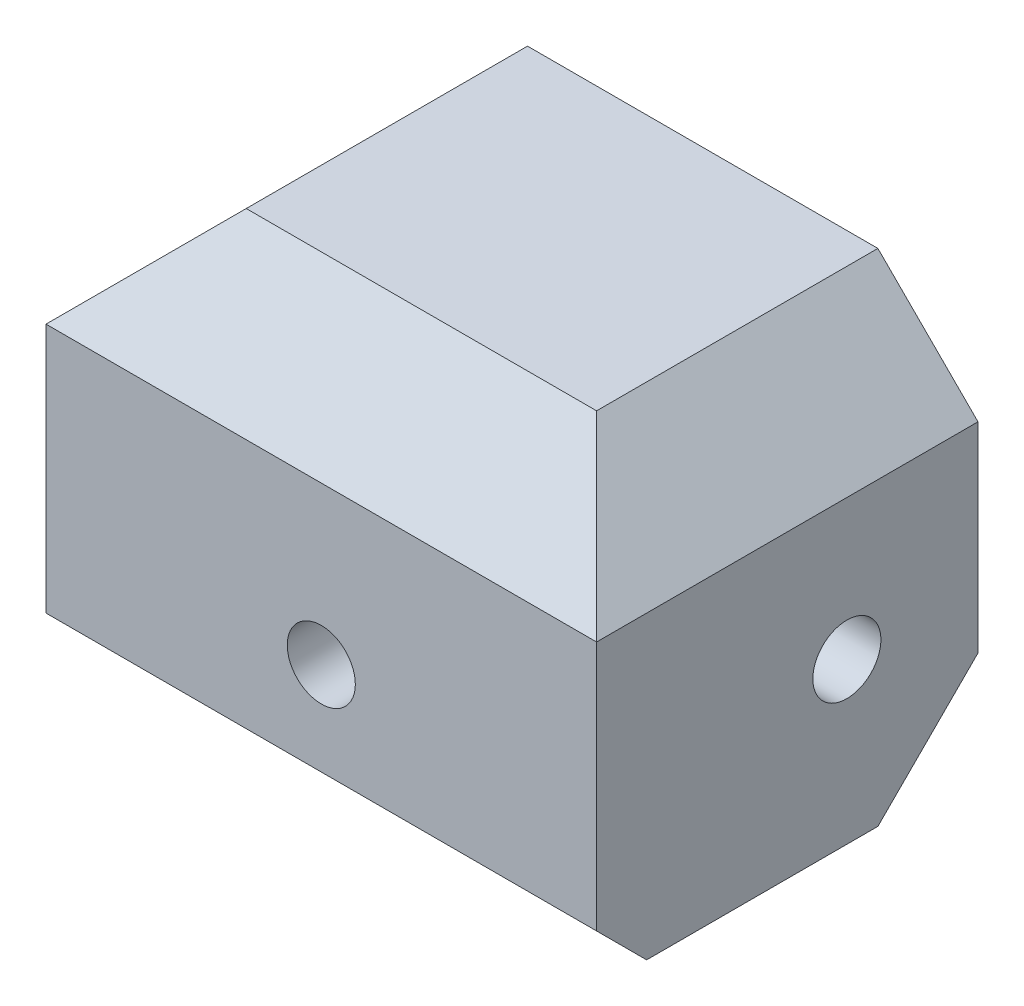
ISO-10303-21;
HEADER;
FILE_DESCRIPTION(('STEP AP214'),'2;1');
FILE_NAME('part.step','',(''),(''),'','','');
FILE_SCHEMA(('AUTOMOTIVE_DESIGN { 1 0 10303 214 1 1 1 1 }'));
ENDSEC;
DATA;
#1=APPLICATION_CONTEXT('core data for automotive mechanical design processes');
#2=APPLICATION_PROTOCOL_DEFINITION('international standard','automotive_design',2000,#1);
#3=PRODUCT_CONTEXT('',#1,'mechanical');
#4=PRODUCT('Part','Part','',(#3));
#5=PRODUCT_RELATED_PRODUCT_CATEGORY('part','',(#4));
#6=PRODUCT_DEFINITION_FORMATION('','',#4);
#7=PRODUCT_DEFINITION_CONTEXT('part definition',#1,'design');
#8=PRODUCT_DEFINITION('design','',#6,#7);
#9=PRODUCT_DEFINITION_SHAPE('','',#8);
#10=(LENGTH_UNIT() NAMED_UNIT(*) SI_UNIT(.MILLI.,.METRE.));
#11=(NAMED_UNIT(*) PLANE_ANGLE_UNIT() SI_UNIT($,.RADIAN.));
#12=(NAMED_UNIT(*) SI_UNIT($,.STERADIAN.) SOLID_ANGLE_UNIT());
#13=UNCERTAINTY_MEASURE_WITH_UNIT(LENGTH_MEASURE(1.E-05),#10,'distance_accuracy_value','');
#14=(GEOMETRIC_REPRESENTATION_CONTEXT(3) GLOBAL_UNCERTAINTY_ASSIGNED_CONTEXT((#13)) GLOBAL_UNIT_ASSIGNED_CONTEXT((#10,
#11,#12)) REPRESENTATION_CONTEXT('',''));
#15=CARTESIAN_POINT('',(0.,0.,0.));
#16=DIRECTION('',(0.,0.,1.));
#17=DIRECTION('',(1.,0.,0.));
#18=AXIS2_PLACEMENT_3D('',#15,#16,#17);
#19=CARTESIAN_POINT('',(-170.364347611488,-245.852505007974,-281.719428592597));
#20=DIRECTION('',(0.,-1.,0.));
#21=DIRECTION('',(0.,0.,-1.));
#22=AXIS2_PLACEMENT_3D('',#19,#20,#21);
#23=CONICAL_SURFACE('',#22,3.39999999999097,1.02974425868382);
#24=CARTESIAN_POINT('',(-170.364347611496,-243.809578903324,-281.719428592597));
#25=VERTEX_POINT('',#24);
#26=VERTEX_LOOP('',#25);
#27=FACE_BOUND('',#26,.T.);
#28=CARTESIAN_POINT('',(-170.364347611488,-245.852505008048,-281.719428592597));
#29=DIRECTION('',(0.,-1.,0.));
#30=DIRECTION('',(0.,0.,-1.));
#31=AXIS2_PLACEMENT_3D('',#28,#29,#30);
#32=CIRCLE('',#31,3.4);
#33=CARTESIAN_POINT('',(-170.364347611488,-245.852505008048,-285.119428592597));
#34=VERTEX_POINT('',#33);
#35=EDGE_CURVE('E311',#34,#34,#32,.T.);
#36=ORIENTED_EDGE('',*,*,#35,.T.);
#37=EDGE_LOOP('',(#36));
#38=FACE_BOUND('',#37,.T.);
#39=ADVANCED_FACE('F17',(#27,#38),#23,.F.);
#40=CARTESIAN_POINT('',(-134.614347611488,-245.852505008031,-281.719428592597));
#41=DIRECTION('',(0.,-1.,0.));
#42=DIRECTION('',(0.,0.,-1.));
#43=AXIS2_PLACEMENT_3D('',#40,#41,#42);
#44=CONICAL_SURFACE('',#43,3.39999999999824,1.02974425867343);
#45=CARTESIAN_POINT('',(-134.614347611489,-243.809578903324,-281.719428592597));
#46=VERTEX_POINT('',#45);
#47=VERTEX_LOOP('',#46);
#48=FACE_BOUND('',#47,.T.);
#49=CARTESIAN_POINT('',(-134.614347611488,-245.852505008048,-281.719428592597));
#50=DIRECTION('',(0.,-1.,0.));
#51=DIRECTION('',(0.,0.,-1.));
#52=AXIS2_PLACEMENT_3D('',#49,#50,#51);
#53=CIRCLE('',#52,3.4);
#54=CARTESIAN_POINT('',(-134.614347611488,-245.852505008048,-285.119428592597));
#55=VERTEX_POINT('',#54);
#56=EDGE_CURVE('E170',#55,#55,#53,.T.);
#57=ORIENTED_EDGE('',*,*,#56,.T.);
#58=EDGE_LOOP('',(#57));
#59=FACE_BOUND('',#58,.T.);
#60=ADVANCED_FACE('F468',(#48,#59),#44,.F.);
#61=CARTESIAN_POINT('',(-170.364347611488,-269.352505008048,-281.719428592597));
#62=DIRECTION('',(0.,-1.,0.));
#63=DIRECTION('',(0.,0.,-1.));
#64=AXIS2_PLACEMENT_3D('',#61,#62,#63);
#65=CYLINDRICAL_SURFACE('',#64,3.4);
#66=ORIENTED_EDGE('',*,*,#35,.F.);
#67=EDGE_LOOP('',(#66));
#68=FACE_BOUND('',#67,.T.);
#69=CARTESIAN_POINT('',(-170.364347611488,-268.681335320139,-281.719428592597));
#70=DIRECTION('',(0.,-1.,0.));
#71=DIRECTION('',(1.,0.,0.));
#72=AXIS2_PLACEMENT_3D('',#69,#70,#71);
#73=CIRCLE('',#72,3.39999999999097);
#74=CARTESIAN_POINT('',(-166.964347611497,-268.681335320139,-281.719428592597));
#75=VERTEX_POINT('',#74);
#76=EDGE_CURVE('E189',#75,#75,#73,.T.);
#77=ORIENTED_EDGE('',*,*,#76,.T.);
#78=EDGE_LOOP('',(#77));
#79=FACE_BOUND('',#78,.T.);
#80=ADVANCED_FACE('F465',(#68,#79),#65,.F.);
#81=CARTESIAN_POINT('',(-134.614347611488,-269.352505008048,-281.719428592597));
#82=DIRECTION('',(0.,-1.,0.));
#83=DIRECTION('',(0.,0.,-1.));
#84=AXIS2_PLACEMENT_3D('',#81,#82,#83);
#85=CYLINDRICAL_SURFACE('',#84,3.4);
#86=ORIENTED_EDGE('',*,*,#56,.F.);
#87=EDGE_LOOP('',(#86));
#88=FACE_BOUND('',#87,.T.);
#89=CARTESIAN_POINT('',(-134.614347611488,-268.681335320139,-281.719428592597));
#90=DIRECTION('',(0.,-1.,0.));
#91=DIRECTION('',(1.,0.,0.));
#92=AXIS2_PLACEMENT_3D('',#89,#90,#91);
#93=CIRCLE('',#92,3.39999999999824);
#94=CARTESIAN_POINT('',(-131.21434761149,-268.681335320139,-281.719428592597));
#95=VERTEX_POINT('',#94);
#96=EDGE_CURVE('E288',#95,#95,#93,.T.);
#97=ORIENTED_EDGE('',*,*,#96,.T.);
#98=EDGE_LOOP('',(#97));
#99=FACE_BOUND('',#98,.T.);
#100=ADVANCED_FACE('F352',(#88,#99),#85,.F.);
#101=CARTESIAN_POINT('',(-170.489350011488,-253.352505008048,-295.619428592597));
#102=DIRECTION('',(1.,0.,0.));
#103=DIRECTION('',(0.,0.,-1.));
#104=AXIS2_PLACEMENT_3D('',#101,#102,#103);
#105=CYLINDRICAL_SURFACE('',#104,6.);
#106=CARTESIAN_POINT('',(-144.239347611488,-253.352505008048,-295.619428592597));
#107=DIRECTION('',(1.,0.,0.));
#108=DIRECTION('',(0.,0.,-1.));
#109=AXIS2_PLACEMENT_3D('',#106,#107,#108);
#110=CIRCLE('',#109,6.);
#111=CARTESIAN_POINT('',(-144.239347611488,-253.352505008048,-301.619428592597));
#112=VERTEX_POINT('',#111);
#113=EDGE_CURVE('E267',#112,#112,#110,.T.);
#114=ORIENTED_EDGE('',*,*,#113,.F.);
#115=EDGE_LOOP('',(#114));
#116=FACE_BOUND('',#115,.T.);
#117=CARTESIAN_POINT('',(-139.489347611489,-253.352505008048,-295.619428592597));
#118=DIRECTION('',(1.,0.,0.));
#119=DIRECTION('',(0.,0.,-1.));
#120=AXIS2_PLACEMENT_3D('',#117,#118,#119);
#121=CIRCLE('',#120,6.);
#122=CARTESIAN_POINT('',(-139.489347611489,-253.352505008048,-301.619428592597));
#123=VERTEX_POINT('',#122);
#124=EDGE_CURVE('E20',#123,#123,#121,.T.);
#125=ORIENTED_EDGE('',*,*,#124,.T.);
#126=EDGE_LOOP('',(#125));
#127=FACE_BOUND('',#126,.T.);
#128=ADVANCED_FACE('F349',(#116,#127),#105,.F.);
#129=CARTESIAN_POINT('',(-155.739347611488,-239.352505008049,-275.042931195113));
#130=DIRECTION('',(0.,0.,1.));
#131=DIRECTION('',(1.,0.,0.));
#132=AXIS2_PLACEMENT_3D('',#129,#130,#131);
#133=CYLINDRICAL_SURFACE('',#132,5.);
#134=DIRECTION('',(0.,0.,-1.));
#135=VECTOR('',#134,1.);
#136=CARTESIAN_POINT('',(-155.739347611488,-234.352505008049,-278.619428592599));
#137=LINE('',#136,#135);
#138=CARTESIAN_POINT('',(-155.739347611488,-234.352505008049,-278.619428592599));
#139=VERTEX_POINT('',#138);
#140=CARTESIAN_POINT('',(-155.739347611488,-234.352505008067,-305.719428592582));
#141=VERTEX_POINT('',#140);
#142=EDGE_CURVE('E163',#139,#141,#137,.T.);
#143=ORIENTED_EDGE('',*,*,#142,.F.);
#144=CARTESIAN_POINT('',(-155.739347611488,-239.352505008049,-278.619428592599));
#145=DIRECTION('',(0.,0.,1.));
#146=DIRECTION('',(1.,0.,0.));
#147=AXIS2_PLACEMENT_3D('',#144,#145,#146);
#148=CIRCLE('',#147,5.);
#149=CARTESIAN_POINT('',(-160.739347611488,-239.352505008049,-278.619428592599));
#150=VERTEX_POINT('',#149);
#151=EDGE_CURVE('E151',#150,#139,#148,.F.);
#152=ORIENTED_EDGE('',*,*,#151,.F.);
#153=DIRECTION('',(0.,0.,-1.));
#154=VECTOR('',#153,1.);
#155=CARTESIAN_POINT('',(-160.739347611488,-239.352505008049,-275.042931195113));
#156=LINE('',#155,#154);
#157=CARTESIAN_POINT('',(-160.739347611491,-239.352505008049,-305.719428592604));
#158=VERTEX_POINT('',#157);
#159=EDGE_CURVE('E146',#158,#150,#156,.F.);
#160=ORIENTED_EDGE('',*,*,#159,.F.);
#161=CARTESIAN_POINT('',(-155.739347611488,-239.352505008049,-305.719428592624));
#162=DIRECTION('',(0.,0.,-1.));
#163=DIRECTION('',(1.,0.,0.));
#164=AXIS2_PLACEMENT_3D('',#161,#162,#163);
#165=CIRCLE('',#164,5.00000000001088);
#166=EDGE_CURVE('E165',#158,#141,#165,.T.);
#167=ORIENTED_EDGE('',*,*,#166,.T.);
#168=EDGE_LOOP('',(#143,#152,#160,#167));
#169=FACE_BOUND('',#168,.T.);
#170=ADVANCED_FACE('F164',(#169),#133,.F.);
#171=CARTESIAN_POINT('',(-160.739347611488,-234.352505008049,-278.619428592599));
#172=DIRECTION('',(0.,-1.,0.));
#173=DIRECTION('',(0.,0.,-1.));
#174=AXIS2_PLACEMENT_3D('',#171,#172,#173);
#175=PLANE('',#174);
#176=ORIENTED_EDGE('',*,*,#142,.T.);
#177=DIRECTION('',(1.,0.,0.));
#178=VECTOR('',#177,1.);
#179=CARTESIAN_POINT('',(-152.489347611488,-234.352505008049,-305.719428592597));
#180=LINE('',#179,#178);
#181=CARTESIAN_POINT('',(-149.239347611488,-234.352505008042,-305.719428592604));
#182=VERTEX_POINT('',#181);
#183=EDGE_CURVE('E211',#141,#182,#180,.T.);
#184=ORIENTED_EDGE('',*,*,#183,.T.);
#185=DIRECTION('',(0.,0.,-1.));
#186=VECTOR('',#185,1.);
#187=CARTESIAN_POINT('',(-149.239347611488,-234.352505008049,-275.042931195113));
#188=LINE('',#187,#186);
#189=CARTESIAN_POINT('',(-149.239347611488,-234.352505008049,-278.619428592599));
#190=VERTEX_POINT('',#189);
#191=EDGE_CURVE('E169',#182,#190,#188,.F.);
#192=ORIENTED_EDGE('',*,*,#191,.T.);
#193=DIRECTION('',(-1.,0.,0.));
#194=VECTOR('',#193,1.);
#195=CARTESIAN_POINT('',(-153.248722611488,-234.352505008049,-278.619428592599));
#196=LINE('',#195,#194);
#197=EDGE_CURVE('E156',#139,#190,#196,.F.);
#198=ORIENTED_EDGE('',*,*,#197,.F.);
#199=EDGE_LOOP('',(#176,#184,#192,#198));
#200=FACE_BOUND('',#199,.T.);
#201=ADVANCED_FACE('F172',(#200),#175,.T.);
#202=CARTESIAN_POINT('',(-149.239347611488,-239.352505008049,-275.042931195113));
#203=DIRECTION('',(0.,0.,-1.));
#204=DIRECTION('',(-1.,0.,0.));
#205=AXIS2_PLACEMENT_3D('',#202,#203,#204);
#206=CYLINDRICAL_SURFACE('',#205,5.);
#207=DIRECTION('',(0.,0.,1.));
#208=VECTOR('',#207,1.);
#209=CARTESIAN_POINT('',(-144.239347611488,-239.352505008049,-275.042931195113));
#210=LINE('',#209,#208);
#211=CARTESIAN_POINT('',(-144.239347611488,-239.352505008049,-278.619428592599));
#212=VERTEX_POINT('',#211);
#213=CARTESIAN_POINT('',(-144.239347611503,-239.352505008049,-305.719428592582));
#214=VERTEX_POINT('',#213);
#215=EDGE_CURVE('E249',#212,#214,#210,.F.);
#216=ORIENTED_EDGE('',*,*,#215,.F.);
#217=CARTESIAN_POINT('',(-149.239347611488,-239.352505008049,-278.619428592599));
#218=DIRECTION('',(0.,0.,-1.));
#219=DIRECTION('',(-1.,0.,0.));
#220=AXIS2_PLACEMENT_3D('',#217,#218,#219);
#221=CIRCLE('',#220,5.);
#222=EDGE_CURVE('E174',#190,#212,#221,.T.);
#223=ORIENTED_EDGE('',*,*,#222,.F.);
#224=ORIENTED_EDGE('',*,*,#191,.F.);
#225=CARTESIAN_POINT('',(-149.239347611488,-239.352505008049,-305.719428592624));
#226=DIRECTION('',(0.,0.,-1.));
#227=DIRECTION('',(1.,0.,0.));
#228=AXIS2_PLACEMENT_3D('',#225,#226,#227);
#229=CIRCLE('',#228,5.0000000000277);
#230=EDGE_CURVE('E217',#182,#214,#229,.T.);
#231=ORIENTED_EDGE('',*,*,#230,.T.);
#232=EDGE_LOOP('',(#216,#223,#224,#231));
#233=FACE_BOUND('',#232,.T.);
#234=ADVANCED_FACE('F361',(#233),#206,.F.);
#235=CARTESIAN_POINT('',(-139.489347611489,-261.738995628892,-289.669428592597));
#236=DIRECTION('',(1.,0.,0.));
#237=DIRECTION('',(0.,0.,-1.));
#238=AXIS2_PLACEMENT_3D('',#235,#236,#237);
#239=PLANE('',#238);
#240=ORIENTED_EDGE('',*,*,#124,.F.);
#241=EDGE_LOOP('',(#240));
#242=FACE_BOUND('',#241,.T.);
#243=CARTESIAN_POINT('',(-139.489347611489,-253.352505008048,-295.619428592597));
#244=DIRECTION('',(-1.,0.,0.));
#245=DIRECTION('',(0.,0.,1.));
#246=AXIS2_PLACEMENT_3D('',#243,#244,#245);
#247=CIRCLE('',#246,3.4);
#248=CARTESIAN_POINT('',(-139.489347611489,-253.352505008048,-292.219428592597));
#249=VERTEX_POINT('',#248);
#250=EDGE_CURVE('E245',#249,#249,#247,.F.);
#251=ORIENTED_EDGE('',*,*,#250,.T.);
#252=EDGE_LOOP('',(#251));
#253=FACE_BOUND('',#252,.T.);
#254=ADVANCED_FACE('F357',(#242,#253),#239,.F.);
#255=CARTESIAN_POINT('',(-142.739347611488,-251.852505008048,-307.219428592597));
#256=DIRECTION('',(-0.707106781186548,0.,-0.707106781186548));
#257=DIRECTION('',(-0.707106781186548,0.,0.707106781186548));
#258=AXIS2_PLACEMENT_3D('',#255,#256,#257);
#259=PLANE('',#258);
#260=DIRECTION('',(0.,1.,0.));
#261=VECTOR('',#260,1.);
#262=CARTESIAN_POINT('',(-144.239347611488,-235.674328388582,-305.719428592597));
#263=LINE('',#262,#261);
#264=CARTESIAN_POINT('',(-144.239347611488,-262.352505008048,-305.719428592597));
#265=VERTEX_POINT('',#264);
#266=EDGE_CURVE('E183',#214,#265,#263,.F.);
#267=ORIENTED_EDGE('',*,*,#266,.F.);
#268=DIRECTION('',(-0.707106781186548,0.,0.707106781186548));
#269=VECTOR('',#268,1.);
#270=CARTESIAN_POINT('',(498550.041223796,-239.352505008049,-499000.));
#271=LINE('',#270,#269);
#272=CARTESIAN_POINT('',(-141.239347611499,-239.352505008049,-308.719428592564));
#273=VERTEX_POINT('',#272);
#274=EDGE_CURVE('E214',#214,#273,#271,.F.);
#275=ORIENTED_EDGE('',*,*,#274,.T.);
#276=DIRECTION('',(0.,1.,0.));
#277=VECTOR('',#276,1.);
#278=CARTESIAN_POINT('',(-141.239347611488,-249.352505008049,-308.719428592597));
#279=LINE('',#278,#277);
#280=CARTESIAN_POINT('',(-141.239347611488,-259.352505008048,-308.719428592597));
#281=VERTEX_POINT('',#280);
#282=EDGE_CURVE('E223',#281,#273,#279,.T.);
#283=ORIENTED_EDGE('',*,*,#282,.F.);
#284=DIRECTION('',(0.577350269189626,0.577350269189626,-0.577350269189626));
#285=VECTOR('',#284,1.);
#286=CARTESIAN_POINT('',(-144.239347611488,-262.352505008048,-305.719428592597));
#287=LINE('',#286,#285);
#288=EDGE_CURVE('E227',#265,#281,#287,.T.);
#289=ORIENTED_EDGE('',*,*,#288,.F.);
#290=EDGE_LOOP('',(#267,#275,#283,#289));
#291=FACE_BOUND('',#290,.T.);
#292=ADVANCED_FACE('F360',(#291),#259,.T.);
#293=CARTESIAN_POINT('',(-149.239347611488,-239.352505008049,-308.719428592497));
#294=DIRECTION('',(0.,0.,-1.));
#295=DIRECTION('',(-1.,0.,0.));
#296=AXIS2_PLACEMENT_3D('',#293,#294,#295);
#297=CONICAL_SURFACE('',#296,7.99999999989992,0.785398163397448);
#298=DIRECTION('',(0.,-0.707106781186548,0.707106781186548));
#299=VECTOR('',#298,1.);
#300=CARTESIAN_POINT('',(-149.239347611488,-232.852505008049,-307.219428592597));
#301=LINE('',#300,#299);
#302=CARTESIAN_POINT('',(-149.239347611488,-231.35250500807,-308.719428592575));
#303=VERTEX_POINT('',#302);
#304=EDGE_CURVE('E206',#182,#303,#301,.F.);
#305=ORIENTED_EDGE('',*,*,#304,.T.);
#306=CARTESIAN_POINT('',(-149.239347611488,-239.352505008049,-308.719428592553));
#307=DIRECTION('',(0.,0.,-1.));
#308=DIRECTION('',(-1.,0.,0.));
#309=AXIS2_PLACEMENT_3D('',#306,#307,#308);
#310=CIRCLE('',#309,7.99999999995676);
#311=EDGE_CURVE('E339',#273,#303,#310,.F.);
#312=ORIENTED_EDGE('',*,*,#311,.F.);
#313=ORIENTED_EDGE('',*,*,#274,.F.);
#314=ORIENTED_EDGE('',*,*,#230,.F.);
#315=EDGE_LOOP('',(#305,#312,#313,#314));
#316=FACE_BOUND('',#315,.T.);
#317=ADVANCED_FACE('F448',(#316),#297,.F.);
#318=CARTESIAN_POINT('',(-152.489347611488,-232.852505008049,-307.219428592597));
#319=DIRECTION('',(0.,0.707106781186548,0.707106781186548));
#320=DIRECTION('',(0.,-0.707106781186548,0.707106781186548));
#321=AXIS2_PLACEMENT_3D('',#318,#319,#320);
#322=PLANE('',#321);
#323=ORIENTED_EDGE('',*,*,#304,.F.);
#324=ORIENTED_EDGE('',*,*,#183,.F.);
#325=DIRECTION('',(0.,-0.707106781186548,0.707106781186548));
#326=VECTOR('',#325,1.);
#327=CARTESIAN_POINT('',(-155.73934761158,498459.928066399,-499000.));
#328=LINE('',#327,#326);
#329=CARTESIAN_POINT('',(-155.739347611488,-231.352505008058,-308.719428592564));
#330=VERTEX_POINT('',#329);
#331=EDGE_CURVE('E203',#141,#330,#328,.F.);
#332=ORIENTED_EDGE('',*,*,#331,.T.);
#333=DIRECTION('',(-1.,0.,0.));
#334=VECTOR('',#333,1.);
#335=CARTESIAN_POINT('',(-152.489347611488,-231.352505008048,-308.719428592597));
#336=LINE('',#335,#334);
#337=EDGE_CURVE('E338',#303,#330,#336,.T.);
#338=ORIENTED_EDGE('',*,*,#337,.F.);
#339=EDGE_LOOP('',(#323,#324,#332,#338));
#340=FACE_BOUND('',#339,.T.);
#341=ADVANCED_FACE('F444',(#340),#322,.F.);
#342=CARTESIAN_POINT('',(-155.739347611488,-239.352505008049,-308.719428592497));
#343=DIRECTION('',(0.,0.,-1.));
#344=DIRECTION('',(-1.,0.,0.));
#345=AXIS2_PLACEMENT_3D('',#342,#343,#344);
#346=CONICAL_SURFACE('',#345,7.9999999998831,0.785398163397448);
#347=DIRECTION('',(-0.707106781186548,0.,-0.707106781186548));
#348=VECTOR('',#347,1.);
#349=CARTESIAN_POINT('',(-162.239347611488,-239.352505008049,-307.219428592597));
#350=LINE('',#349,#348);
#351=CARTESIAN_POINT('',(-163.739347611466,-239.352505008049,-308.719428592575));
#352=VERTEX_POINT('',#351);
#353=EDGE_CURVE('E186',#352,#158,#350,.F.);
#354=ORIENTED_EDGE('',*,*,#353,.F.);
#355=CARTESIAN_POINT('',(-155.739347611488,-239.352505008049,-308.719428592553));
#356=DIRECTION('',(0.,0.,-1.));
#357=DIRECTION('',(-1.,0.,0.));
#358=AXIS2_PLACEMENT_3D('',#355,#356,#357);
#359=CIRCLE('',#358,7.99999999993994);
#360=EDGE_CURVE('E336',#330,#352,#359,.F.);
#361=ORIENTED_EDGE('',*,*,#360,.F.);
#362=ORIENTED_EDGE('',*,*,#331,.F.);
#363=ORIENTED_EDGE('',*,*,#166,.F.);
#364=EDGE_LOOP('',(#354,#361,#362,#363));
#365=FACE_BOUND('',#364,.T.);
#366=ADVANCED_FACE('F440',(#365),#346,.F.);
#367=CARTESIAN_POINT('',(-162.239347611488,-251.852505008048,-307.219428592597));
#368=DIRECTION('',(0.707106781186548,0.,-0.707106781186548));
#369=DIRECTION('',(-0.707106781186548,0.,-0.707106781186548));
#370=AXIS2_PLACEMENT_3D('',#367,#368,#369);
#371=PLANE('',#370);
#372=DIRECTION('',(0.,1.,0.));
#373=VECTOR('',#372,1.);
#374=CARTESIAN_POINT('',(-163.739347611488,-249.352505008049,-308.719428592597));
#375=LINE('',#374,#373);
#376=CARTESIAN_POINT('',(-163.739347611488,-259.352505008048,-308.719428592597));
#377=VERTEX_POINT('',#376);
#378=EDGE_CURVE('E196',#352,#377,#375,.F.);
#379=ORIENTED_EDGE('',*,*,#378,.F.);
#380=ORIENTED_EDGE('',*,*,#353,.T.);
#381=DIRECTION('',(0.,1.,0.));
#382=VECTOR('',#381,1.);
#383=CARTESIAN_POINT('',(-160.739347611488,-270.674328388582,-305.719428592597));
#384=LINE('',#383,#382);
#385=CARTESIAN_POINT('',(-160.739347611488,-262.352505008048,-305.719428592597));
#386=VERTEX_POINT('',#385);
#387=EDGE_CURVE('E281',#386,#158,#384,.T.);
#388=ORIENTED_EDGE('',*,*,#387,.F.);
#389=DIRECTION('',(0.577350269189626,-0.577350269189626,0.577350269189626));
#390=VECTOR('',#389,1.);
#391=CARTESIAN_POINT('',(-163.739347611488,-259.352505008048,-308.719428592597));
#392=LINE('',#391,#390);
#393=EDGE_CURVE('E195',#377,#386,#392,.T.);
#394=ORIENTED_EDGE('',*,*,#393,.F.);
#395=EDGE_LOOP('',(#379,#380,#388,#394));
#396=FACE_BOUND('',#395,.T.);
#397=ADVANCED_FACE('F436',(#396),#371,.T.);
#398=CARTESIAN_POINT('',(-170.364347611488,-269.352505008044,-281.719428592597));
#399=DIRECTION('',(0.,-1.,0.));
#400=DIRECTION('',(0.,0.,-1.));
#401=AXIS2_PLACEMENT_3D('',#398,#399,#400);
#402=CONICAL_SURFACE('',#401,4.56249999995495,1.04719755120111);
#403=CARTESIAN_POINT('',(-170.364347611488,-269.352505008049,-281.719428592597));
#404=DIRECTION('',(0.,-1.,0.));
#405=DIRECTION('',(0.,0.,-1.));
#406=AXIS2_PLACEMENT_3D('',#403,#404,#405);
#407=CIRCLE('',#406,4.56249999996317);
#408=CARTESIAN_POINT('',(-170.364347611488,-269.352505008049,-286.28192859256));
#409=VERTEX_POINT('',#408);
#410=EDGE_CURVE('E292',#409,#409,#407,.F.);
#411=ORIENTED_EDGE('',*,*,#410,.F.);
#412=EDGE_LOOP('',(#411));
#413=FACE_BOUND('',#412,.T.);
#414=ORIENTED_EDGE('',*,*,#76,.F.);
#415=EDGE_LOOP('',(#414));
#416=FACE_BOUND('',#415,.T.);
#417=ADVANCED_FACE('F428',(#413,#416),#402,.F.);
#418=CARTESIAN_POINT('',(-134.614347611488,-269.352505008044,-281.719428592597));
#419=DIRECTION('',(0.,-1.,0.));
#420=DIRECTION('',(0.,0.,-1.));
#421=AXIS2_PLACEMENT_3D('',#418,#419,#420);
#422=CONICAL_SURFACE('',#421,4.56249999996222,1.04719755120111);
#423=CARTESIAN_POINT('',(-134.614347611488,-269.352505008044,-281.719428592597));
#424=DIRECTION('',(0.,-1.,0.));
#425=DIRECTION('',(0.,0.,-1.));
#426=AXIS2_PLACEMENT_3D('',#423,#424,#425);
#427=CIRCLE('',#426,4.56249999996317);
#428=CARTESIAN_POINT('',(-134.614347611488,-269.352505008044,-286.28192859256));
#429=VERTEX_POINT('',#428);
#430=EDGE_CURVE('E262',#429,#429,#427,.F.);
#431=ORIENTED_EDGE('',*,*,#430,.F.);
#432=EDGE_LOOP('',(#431));
#433=FACE_BOUND('',#432,.T.);
#434=ORIENTED_EDGE('',*,*,#96,.F.);
#435=EDGE_LOOP('',(#434));
#436=FACE_BOUND('',#435,.T.);
#437=ADVANCED_FACE('F420',(#433,#436),#422,.F.);
#438=CARTESIAN_POINT('',(-160.739347611488,-270.674328388582,-275.042931195113));
#439=DIRECTION('',(1.,0.,0.));
#440=DIRECTION('',(0.,0.,-1.));
#441=AXIS2_PLACEMENT_3D('',#438,#439,#440);
#442=PLANE('',#441);
#443=DIRECTION('',(0.,0.,-1.));
#444=VECTOR('',#443,1.);
#445=CARTESIAN_POINT('',(-160.739347611488,-269.352505008048,-275.042931195113));
#446=LINE('',#445,#444);
#447=CARTESIAN_POINT('',(-160.739347611488,-269.352505008048,-298.719428592597));
#448=VERTEX_POINT('',#447);
#449=CARTESIAN_POINT('',(-160.739347611488,-269.352505008048,-278.619428592599));
#450=VERTEX_POINT('',#449);
#451=EDGE_CURVE('E272',#448,#450,#446,.F.);
#452=ORIENTED_EDGE('',*,*,#451,.F.);
#453=DIRECTION('',(0.,0.707106781186548,-0.707106781186548));
#454=VECTOR('',#453,1.);
#455=CARTESIAN_POINT('',(-160.739347611488,-264.352505008048,-303.719428592597));
#456=LINE('',#455,#454);
#457=EDGE_CURVE('E200',#386,#448,#456,.F.);
#458=ORIENTED_EDGE('',*,*,#457,.F.);
#459=ORIENTED_EDGE('',*,*,#387,.T.);
#460=ORIENTED_EDGE('',*,*,#159,.T.);
#461=DIRECTION('',(0.,1.,0.));
#462=VECTOR('',#461,1.);
#463=CARTESIAN_POINT('',(-160.739347611488,-447.019503363955,-278.619428592599));
#464=LINE('',#463,#462);
#465=EDGE_CURVE('E159',#450,#150,#464,.T.);
#466=ORIENTED_EDGE('',*,*,#465,.F.);
#467=EDGE_LOOP('',(#452,#458,#459,#460,#466));
#468=FACE_BOUND('',#467,.T.);
#469=CARTESIAN_POINT('',(-160.739347611488,-253.352505008048,-295.619428592597));
#470=DIRECTION('',(1.,0.,0.));
#471=DIRECTION('',(0.,0.,-1.));
#472=AXIS2_PLACEMENT_3D('',#469,#470,#471);
#473=CIRCLE('',#472,6.);
#474=CARTESIAN_POINT('',(-160.739347611488,-253.352505008048,-301.619428592597));
#475=VERTEX_POINT('',#474);
#476=EDGE_CURVE('E224',#475,#475,#473,.F.);
#477=ORIENTED_EDGE('',*,*,#476,.T.);
#478=EDGE_LOOP('',(#477));
#479=FACE_BOUND('',#478,.T.);
#480=ADVANCED_FACE('F418',(#468,#479),#442,.T.);
#481=CARTESIAN_POINT('',(-144.239347611488,-235.674328388582,-275.042931195113));
#482=DIRECTION('',(-1.,0.,0.));
#483=DIRECTION('',(0.,0.,1.));
#484=AXIS2_PLACEMENT_3D('',#481,#482,#483);
#485=PLANE('',#484);
#486=ORIENTED_EDGE('',*,*,#266,.T.);
#487=DIRECTION('',(0.,0.707106781186548,-0.707106781186548));
#488=VECTOR('',#487,1.);
#489=CARTESIAN_POINT('',(-144.239347611488,-264.352505008048,-303.719428592597));
#490=LINE('',#489,#488);
#491=CARTESIAN_POINT('',(-144.239347611488,-269.352505008048,-298.719428592597));
#492=VERTEX_POINT('',#491);
#493=EDGE_CURVE('E229',#492,#265,#490,.T.);
#494=ORIENTED_EDGE('',*,*,#493,.F.);
#495=DIRECTION('',(0.,0.,-1.));
#496=VECTOR('',#495,1.);
#497=CARTESIAN_POINT('',(-144.239347611488,-269.352505008048,-275.042931195113));
#498=LINE('',#497,#496);
#499=CARTESIAN_POINT('',(-144.239347611488,-269.352505008048,-278.619428592599));
#500=VERTEX_POINT('',#499);
#501=EDGE_CURVE('E252',#500,#492,#498,.T.);
#502=ORIENTED_EDGE('',*,*,#501,.F.);
#503=DIRECTION('',(0.,1.,0.));
#504=VECTOR('',#503,1.);
#505=CARTESIAN_POINT('',(-144.239347611488,-447.019503363955,-278.619428592599));
#506=LINE('',#505,#504);
#507=EDGE_CURVE('E176',#212,#500,#506,.F.);
#508=ORIENTED_EDGE('',*,*,#507,.F.);
#509=ORIENTED_EDGE('',*,*,#215,.T.);
#510=EDGE_LOOP('',(#486,#494,#502,#508,#509));
#511=FACE_BOUND('',#510,.T.);
#512=ORIENTED_EDGE('',*,*,#113,.T.);
#513=EDGE_LOOP('',(#512));
#514=FACE_BOUND('',#513,.T.);
#515=ADVANCED_FACE('F347',(#511,#514),#485,.T.);
#516=CARTESIAN_POINT('',(-153.248722611488,-447.019503363955,-278.619428592599));
#517=DIRECTION('',(0.,0.,-1.));
#518=DIRECTION('',(-1.,0.,0.));
#519=AXIS2_PLACEMENT_3D('',#516,#517,#518);
#520=PLANE('',#519);
#521=ORIENTED_EDGE('',*,*,#507,.T.);
#522=DIRECTION('',(1.,0.,0.));
#523=VECTOR('',#522,1.);
#524=CARTESIAN_POINT('',(-167.489347611488,-269.352505008048,-278.619428592599));
#525=LINE('',#524,#523);
#526=EDGE_CURVE('E256',#450,#500,#525,.T.);
#527=ORIENTED_EDGE('',*,*,#526,.F.);
#528=ORIENTED_EDGE('',*,*,#465,.T.);
#529=ORIENTED_EDGE('',*,*,#151,.T.);
#530=ORIENTED_EDGE('',*,*,#197,.T.);
#531=ORIENTED_EDGE('',*,*,#222,.T.);
#532=EDGE_LOOP('',(#521,#527,#528,#529,#530,#531));
#533=FACE_BOUND('',#532,.T.);
#534=CARTESIAN_POINT('',(-152.489347611488,-255.065005008049,-278.619428592599));
#535=DIRECTION('',(0.,0.,1.));
#536=DIRECTION('',(1.,0.,0.));
#537=AXIS2_PLACEMENT_3D('',#534,#535,#536);
#538=CIRCLE('',#537,3.4);
#539=CARTESIAN_POINT('',(-149.089347611488,-255.065005008049,-278.619428592599));
#540=VERTEX_POINT('',#539);
#541=EDGE_CURVE('E328',#540,#540,#538,.T.);
#542=ORIENTED_EDGE('',*,*,#541,.T.);
#543=EDGE_LOOP('',(#542));
#544=FACE_BOUND('',#543,.T.);
#545=ADVANCED_FACE('F153',(#533,#544),#520,.T.);
#546=CARTESIAN_POINT('',(-131.989347611489,-253.352505008048,-295.619428592597));
#547=DIRECTION('',(-1.,0.,0.));
#548=DIRECTION('',(0.,0.,1.));
#549=AXIS2_PLACEMENT_3D('',#546,#547,#548);
#550=CYLINDRICAL_SURFACE('',#549,3.4);
#551=ORIENTED_EDGE('',*,*,#250,.F.);
#552=EDGE_LOOP('',(#551));
#553=FACE_BOUND('',#552,.T.);
#554=CARTESIAN_POINT('',(-124.989347611488,-253.352505008048,-295.619428592597));
#555=DIRECTION('',(-1.,0.,0.));
#556=DIRECTION('',(0.,0.,1.));
#557=AXIS2_PLACEMENT_3D('',#554,#555,#556);
#558=CIRCLE('',#557,3.4);
#559=CARTESIAN_POINT('',(-124.989347611488,-253.352505008048,-292.219428592597));
#560=VERTEX_POINT('',#559);
#561=EDGE_CURVE('E324',#560,#560,#558,.T.);
#562=ORIENTED_EDGE('',*,*,#561,.F.);
#563=EDGE_LOOP('',(#562));
#564=FACE_BOUND('',#563,.T.);
#565=ADVANCED_FACE('F365',(#553,#564),#550,.F.);
#566=CARTESIAN_POINT('',(-133.114347611488,-264.352505008048,-303.719428592597));
#567=DIRECTION('',(0.,-0.707106781186548,-0.707106781186548));
#568=DIRECTION('',(0.,0.707106781186548,-0.707106781186548));
#569=AXIS2_PLACEMENT_3D('',#566,#567,#568);
#570=PLANE('',#569);
#571=ORIENTED_EDGE('',*,*,#493,.T.);
#572=ORIENTED_EDGE('',*,*,#288,.T.);
#573=DIRECTION('',(-1.,0.,0.));
#574=VECTOR('',#573,1.);
#575=CARTESIAN_POINT('',(-152.489347611488,-259.352505008048,-308.719428592597));
#576=LINE('',#575,#574);
#577=CARTESIAN_POINT('',(-124.989347611488,-259.352505008048,-308.719428592597));
#578=VERTEX_POINT('',#577);
#579=EDGE_CURVE('E220',#578,#281,#576,.T.);
#580=ORIENTED_EDGE('',*,*,#579,.F.);
#581=DIRECTION('',(0.,0.707106781186547,-0.707106781186547));
#582=VECTOR('',#581,1.);
#583=CARTESIAN_POINT('',(-124.989347611488,-269.352505008048,-298.719428592597));
#584=LINE('',#583,#582);
#585=CARTESIAN_POINT('',(-124.989347611488,-269.352505008048,-298.719428592597));
#586=VERTEX_POINT('',#585);
#587=EDGE_CURVE('E232',#586,#578,#584,.T.);
#588=ORIENTED_EDGE('',*,*,#587,.F.);
#589=DIRECTION('',(1.,0.,0.));
#590=VECTOR('',#589,1.);
#591=CARTESIAN_POINT('',(-167.489347611488,-269.352505008048,-298.719428592597));
#592=LINE('',#591,#590);
#593=EDGE_CURVE('E259',#492,#586,#592,.T.);
#594=ORIENTED_EDGE('',*,*,#593,.F.);
#595=EDGE_LOOP('',(#571,#572,#580,#588,#594));
#596=FACE_BOUND('',#595,.T.);
#597=ADVANCED_FACE('F368',(#596),#570,.T.);
#598=CARTESIAN_POINT('',(-170.489350011488,-253.352505008048,-295.619428592597));
#599=DIRECTION('',(1.,0.,0.));
#600=DIRECTION('',(0.,0.,-1.));
#601=AXIS2_PLACEMENT_3D('',#598,#599,#600);
#602=CYLINDRICAL_SURFACE('',#601,6.);
#603=CARTESIAN_POINT('',(-179.989347611488,-253.352505008048,-295.619428592597));
#604=DIRECTION('',(1.,0.,0.));
#605=DIRECTION('',(0.,0.,-1.));
#606=AXIS2_PLACEMENT_3D('',#603,#604,#605);
#607=CIRCLE('',#606,6.);
#608=CARTESIAN_POINT('',(-179.989347611488,-253.352505008048,-301.619428592597));
#609=VERTEX_POINT('',#608);
#610=EDGE_CURVE('E319',#609,#609,#607,.T.);
#611=ORIENTED_EDGE('',*,*,#610,.F.);
#612=EDGE_LOOP('',(#611));
#613=FACE_BOUND('',#612,.T.);
#614=ORIENTED_EDGE('',*,*,#476,.F.);
#615=EDGE_LOOP('',(#614));
#616=FACE_BOUND('',#615,.T.);
#617=ADVANCED_FACE('F411',(#613,#616),#602,.F.);
#618=CARTESIAN_POINT('',(-152.489347611488,-249.352505008049,-308.719428592597));
#619=DIRECTION('',(0.,0.,-1.));
#620=DIRECTION('',(-1.,0.,0.));
#621=AXIS2_PLACEMENT_3D('',#618,#619,#620);
#622=PLANE('',#621);
#623=ORIENTED_EDGE('',*,*,#360,.T.);
#624=ORIENTED_EDGE('',*,*,#378,.T.);
#625=DIRECTION('',(1.,0.,0.));
#626=VECTOR('',#625,1.);
#627=CARTESIAN_POINT('',(-171.864347611488,-259.352505008048,-308.719428592597));
#628=LINE('',#627,#626);
#629=CARTESIAN_POINT('',(-179.989347611488,-259.352505008048,-308.719428592597));
#630=VERTEX_POINT('',#629);
#631=EDGE_CURVE('E192',#630,#377,#628,.T.);
#632=ORIENTED_EDGE('',*,*,#631,.F.);
#633=DIRECTION('',(0.,1.,0.));
#634=VECTOR('',#633,1.);
#635=CARTESIAN_POINT('',(-179.989347611488,-220.674328388582,-308.719428592597));
#636=LINE('',#635,#634);
#637=CARTESIAN_POINT('',(-179.989347611488,-239.352505008048,-308.719428592597));
#638=VERTEX_POINT('',#637);
#639=EDGE_CURVE('E771',#638,#630,#636,.F.);
#640=ORIENTED_EDGE('',*,*,#639,.F.);
#641=DIRECTION('',(-0.707106781186548,-0.707106781186548,0.));
#642=VECTOR('',#641,1.);
#643=CARTESIAN_POINT('',(-174.989347611488,-234.352505008048,-308.719428592597));
#644=LINE('',#643,#642);
#645=CARTESIAN_POINT('',(-169.989347611488,-229.352505008048,-308.719428592597));
#646=VERTEX_POINT('',#645);
#647=EDGE_CURVE('E255',#646,#638,#644,.T.);
#648=ORIENTED_EDGE('',*,*,#647,.F.);
#649=DIRECTION('',(1.,0.,0.));
#650=VECTOR('',#649,1.);
#651=CARTESIAN_POINT('',(-137.489347611488,-229.352505008048,-308.719428592597));
#652=LINE('',#651,#650);
#653=CARTESIAN_POINT('',(-134.989347611488,-229.352505008048,-308.719428592597));
#654=VERTEX_POINT('',#653);
#655=EDGE_CURVE('E738',#654,#646,#652,.F.);
#656=ORIENTED_EDGE('',*,*,#655,.F.);
#657=DIRECTION('',(-0.707106781186548,0.707106781186548,0.));
#658=VECTOR('',#657,1.);
#659=CARTESIAN_POINT('',(-129.989347611488,-234.352505008048,-308.719428592597));
#660=LINE('',#659,#658);
#661=CARTESIAN_POINT('',(-124.989347611488,-239.352505008048,-308.719428592597));
#662=VERTEX_POINT('',#661);
#663=EDGE_CURVE('E331',#662,#654,#660,.T.);
#664=ORIENTED_EDGE('',*,*,#663,.F.);
#665=DIRECTION('',(0.,1.,0.));
#666=VECTOR('',#665,1.);
#667=CARTESIAN_POINT('',(-124.989347611488,-285.674328388582,-308.719428592597));
#668=LINE('',#667,#666);
#669=EDGE_CURVE('E234',#578,#662,#668,.T.);
#670=ORIENTED_EDGE('',*,*,#669,.F.);
#671=ORIENTED_EDGE('',*,*,#579,.T.);
#672=ORIENTED_EDGE('',*,*,#282,.T.);
#673=ORIENTED_EDGE('',*,*,#311,.T.);
#674=ORIENTED_EDGE('',*,*,#337,.T.);
#675=EDGE_LOOP('',(#623,#624,#632,#640,#648,#656,#664,#670,#671,#672,#673,#674));
#676=FACE_BOUND('',#675,.T.);
#677=ADVANCED_FACE('F414',(#676),#622,.T.);
#678=CARTESIAN_POINT('',(-171.864347611488,-264.352505008048,-303.719428592597));
#679=DIRECTION('',(0.,-0.707106781186548,-0.707106781186548));
#680=DIRECTION('',(0.,0.707106781186548,-0.707106781186548));
#681=AXIS2_PLACEMENT_3D('',#678,#679,#680);
#682=PLANE('',#681);
#683=DIRECTION('',(1.,0.,0.));
#684=VECTOR('',#683,1.);
#685=CARTESIAN_POINT('',(-167.489347611488,-269.352505008048,-298.719428592597));
#686=LINE('',#685,#684);
#687=CARTESIAN_POINT('',(-179.989347611488,-269.352505008048,-298.719428592597));
#688=VERTEX_POINT('',#687);
#689=EDGE_CURVE('E261',#688,#448,#686,.T.);
#690=ORIENTED_EDGE('',*,*,#689,.F.);
#691=DIRECTION('',(0.,-0.707106781186547,0.707106781186547));
#692=VECTOR('',#691,1.);
#693=CARTESIAN_POINT('',(-179.989347611488,-259.352505008048,-308.719428592597));
#694=LINE('',#693,#692);
#695=EDGE_CURVE('E773',#630,#688,#694,.T.);
#696=ORIENTED_EDGE('',*,*,#695,.F.);
#697=ORIENTED_EDGE('',*,*,#631,.T.);
#698=ORIENTED_EDGE('',*,*,#393,.T.);
#699=ORIENTED_EDGE('',*,*,#457,.T.);
#700=EDGE_LOOP('',(#690,#696,#697,#698,#699));
#701=FACE_BOUND('',#700,.T.);
#702=ADVANCED_FACE('F631',(#701),#682,.T.);
#703=CARTESIAN_POINT('',(-167.489347611488,-269.352505008048,-275.042931195113));
#704=DIRECTION('',(0.,-1.,0.));
#705=DIRECTION('',(0.,0.,-1.));
#706=AXIS2_PLACEMENT_3D('',#703,#704,#705);
#707=PLANE('',#706);
#708=ORIENTED_EDGE('',*,*,#526,.T.);
#709=ORIENTED_EDGE('',*,*,#501,.T.);
#710=ORIENTED_EDGE('',*,*,#593,.T.);
#711=DIRECTION('',(0.,0.,-1.));
#712=VECTOR('',#711,1.);
#713=CARTESIAN_POINT('',(-124.989347611488,-269.352505008048,-275.042931195113));
#714=LINE('',#713,#712);
#715=CARTESIAN_POINT('',(-124.989347611488,-269.352505008048,-275.619428592597));
#716=VERTEX_POINT('',#715);
#717=EDGE_CURVE('E235',#716,#586,#714,.T.);
#718=ORIENTED_EDGE('',*,*,#717,.F.);
#719=DIRECTION('',(1.,0.,0.));
#720=VECTOR('',#719,1.);
#721=CARTESIAN_POINT('',(-152.489347611488,-269.352505008048,-275.619428592597));
#722=LINE('',#721,#720);
#723=CARTESIAN_POINT('',(-179.989347611488,-269.352505008048,-275.619428592597));
#724=VERTEX_POINT('',#723);
#725=EDGE_CURVE('E323',#716,#724,#722,.F.);
#726=ORIENTED_EDGE('',*,*,#725,.T.);
#727=DIRECTION('',(0.,0.,1.));
#728=VECTOR('',#727,1.);
#729=CARTESIAN_POINT('',(-179.989347611488,-269.352505008048,-275.042931195113));
#730=LINE('',#729,#728);
#731=EDGE_CURVE('E775',#688,#724,#730,.T.);
#732=ORIENTED_EDGE('',*,*,#731,.F.);
#733=ORIENTED_EDGE('',*,*,#689,.T.);
#734=ORIENTED_EDGE('',*,*,#451,.T.);
#735=EDGE_LOOP('',(#708,#709,#710,#718,#726,#732,#733,#734));
#736=FACE_BOUND('',#735,.T.);
#737=ORIENTED_EDGE('',*,*,#430,.T.);
#738=EDGE_LOOP('',(#737));
#739=FACE_BOUND('',#738,.T.);
#740=ORIENTED_EDGE('',*,*,#410,.T.);
#741=EDGE_LOOP('',(#740));
#742=FACE_BOUND('',#741,.T.);
#743=ADVANCED_FACE('F641',(#736,#739,#742),#707,.T.);
#744=CARTESIAN_POINT('',(-174.989347611488,-234.352505008048,-289.669428592597));
#745=DIRECTION('',(-0.707106781186548,0.707106781186548,0.));
#746=DIRECTION('',(-0.707106781186548,-0.707106781186548,0.));
#747=AXIS2_PLACEMENT_3D('',#744,#745,#746);
#748=PLANE('',#747);
#749=DIRECTION('',(0.,0.,1.));
#750=VECTOR('',#749,1.);
#751=CARTESIAN_POINT('',(-169.989347611488,-229.352505008048,-275.042931195113));
#752=LINE('',#751,#750);
#753=CARTESIAN_POINT('',(-169.989347611488,-229.352505008048,-280.619428592597));
#754=VERTEX_POINT('',#753);
#755=EDGE_CURVE('E736',#646,#754,#752,.T.);
#756=ORIENTED_EDGE('',*,*,#755,.F.);
#757=ORIENTED_EDGE('',*,*,#647,.T.);
#758=DIRECTION('',(0.,0.,1.));
#759=VECTOR('',#758,1.);
#760=CARTESIAN_POINT('',(-179.989347611488,-239.352505008048,-275.042931195113));
#761=LINE('',#760,#759);
#762=CARTESIAN_POINT('',(-179.989347611488,-239.352505008048,-270.619428592597));
#763=VERTEX_POINT('',#762);
#764=EDGE_CURVE('E322',#763,#638,#761,.F.);
#765=ORIENTED_EDGE('',*,*,#764,.F.);
#766=DIRECTION('',(0.577350269189625,0.577350269189626,-0.577350269189626));
#767=VECTOR('',#766,1.);
#768=CARTESIAN_POINT('',(-179.989347611488,-239.352505008048,-270.619428592597));
#769=LINE('',#768,#767);
#770=EDGE_CURVE('E34',#763,#754,#769,.T.);
#771=ORIENTED_EDGE('',*,*,#770,.T.);
#772=EDGE_LOOP('',(#756,#757,#765,#771));
#773=FACE_BOUND('',#772,.T.);
#774=ADVANCED_FACE('F651',(#773),#748,.T.);
#775=CARTESIAN_POINT('',(-137.489347611488,-229.352505008048,-275.042931195113));
#776=DIRECTION('',(0.,1.,0.));
#777=DIRECTION('',(0.,0.,1.));
#778=AXIS2_PLACEMENT_3D('',#775,#776,#777);
#779=PLANE('',#778);
#780=ORIENTED_EDGE('',*,*,#755,.T.);
#781=DIRECTION('',(1.,0.,0.));
#782=VECTOR('',#781,1.);
#783=CARTESIAN_POINT('',(-152.489347611488,-229.352505008048,-280.619428592597));
#784=LINE('',#783,#782);
#785=CARTESIAN_POINT('',(-134.989347611488,-229.352505008048,-280.619428592597));
#786=VERTEX_POINT('',#785);
#787=EDGE_CURVE('E779',#754,#786,#784,.T.);
#788=ORIENTED_EDGE('',*,*,#787,.T.);
#789=DIRECTION('',(0.,0.,1.));
#790=VECTOR('',#789,1.);
#791=CARTESIAN_POINT('',(-134.989347611488,-229.352505008048,-289.669428592597));
#792=LINE('',#791,#790);
#793=EDGE_CURVE('E734',#654,#786,#792,.T.);
#794=ORIENTED_EDGE('',*,*,#793,.F.);
#795=ORIENTED_EDGE('',*,*,#655,.T.);
#796=EDGE_LOOP('',(#780,#788,#794,#795));
#797=FACE_BOUND('',#796,.T.);
#798=ADVANCED_FACE('F661',(#797),#779,.T.);
#799=CARTESIAN_POINT('',(-129.989347611488,-234.352505008048,-289.669428592597));
#800=DIRECTION('',(0.707106781186548,0.707106781186548,0.));
#801=DIRECTION('',(-0.707106781186548,0.707106781186548,0.));
#802=AXIS2_PLACEMENT_3D('',#799,#800,#801);
#803=PLANE('',#802);
#804=DIRECTION('',(0.,0.,-1.));
#805=VECTOR('',#804,1.);
#806=CARTESIAN_POINT('',(-124.989347611488,-239.352505008048,-275.042931195113));
#807=LINE('',#806,#805);
#808=CARTESIAN_POINT('',(-124.989347611488,-239.352505008048,-270.619428592597));
#809=VERTEX_POINT('',#808);
#810=EDGE_CURVE('E327',#662,#809,#807,.F.);
#811=ORIENTED_EDGE('',*,*,#810,.F.);
#812=ORIENTED_EDGE('',*,*,#663,.T.);
#813=ORIENTED_EDGE('',*,*,#793,.T.);
#814=DIRECTION('',(0.577350269189626,-0.577350269189626,0.577350269189626));
#815=VECTOR('',#814,1.);
#816=CARTESIAN_POINT('',(-134.989347611488,-229.352505008048,-280.619428592597));
#817=LINE('',#816,#815);
#818=EDGE_CURVE('E318',#786,#809,#817,.T.);
#819=ORIENTED_EDGE('',*,*,#818,.T.);
#820=EDGE_LOOP('',(#811,#812,#813,#819));
#821=FACE_BOUND('',#820,.T.);
#822=ADVANCED_FACE('F386',(#821),#803,.T.);
#823=CARTESIAN_POINT('',(-152.489347611488,-255.065005008049,-270.619428592597));
#824=DIRECTION('',(0.,0.,1.));
#825=DIRECTION('',(1.,0.,0.));
#826=AXIS2_PLACEMENT_3D('',#823,#824,#825);
#827=CYLINDRICAL_SURFACE('',#826,3.4);
#828=ORIENTED_EDGE('',*,*,#541,.F.);
#829=EDGE_LOOP('',(#828));
#830=FACE_BOUND('',#829,.T.);
#831=CARTESIAN_POINT('',(-152.489347611488,-255.065005008049,-270.619428592597));
#832=DIRECTION('',(0.,0.,1.));
#833=DIRECTION('',(1.,0.,0.));
#834=AXIS2_PLACEMENT_3D('',#831,#832,#833);
#835=CIRCLE('',#834,3.4);
#836=CARTESIAN_POINT('',(-149.089347611488,-255.065005008049,-270.619428592597));
#837=VERTEX_POINT('',#836);
#838=EDGE_CURVE('E314',#837,#837,#835,.T.);
#839=ORIENTED_EDGE('',*,*,#838,.T.);
#840=EDGE_LOOP('',(#839));
#841=FACE_BOUND('',#840,.T.);
#842=ADVANCED_FACE('F375',(#830,#841),#827,.F.);
#843=CARTESIAN_POINT('',(-124.989347611488,-285.674328388582,-275.042931195113));
#844=DIRECTION('',(1.,0.,0.));
#845=DIRECTION('',(0.,0.,-1.));
#846=AXIS2_PLACEMENT_3D('',#843,#844,#845);
#847=PLANE('',#846);
#848=ORIENTED_EDGE('',*,*,#587,.T.);
#849=ORIENTED_EDGE('',*,*,#669,.T.);
#850=ORIENTED_EDGE('',*,*,#810,.T.);
#851=DIRECTION('',(0.,1.,0.));
#852=VECTOR('',#851,1.);
#853=CARTESIAN_POINT('',(-124.989347611488,-447.019503363955,-270.619428592597));
#854=LINE('',#853,#852);
#855=CARTESIAN_POINT('',(-124.989347611488,-264.352505008048,-270.619428592597));
#856=VERTEX_POINT('',#855);
#857=EDGE_CURVE('E317',#809,#856,#854,.F.);
#858=ORIENTED_EDGE('',*,*,#857,.T.);
#859=DIRECTION('',(0.,0.707106781186548,0.707106781186548));
#860=VECTOR('',#859,1.);
#861=CARTESIAN_POINT('',(-124.989347611488,-266.852505008048,-273.119428592597));
#862=LINE('',#861,#860);
#863=EDGE_CURVE('E240',#856,#716,#862,.F.);
#864=ORIENTED_EDGE('',*,*,#863,.T.);
#865=ORIENTED_EDGE('',*,*,#717,.T.);
#866=EDGE_LOOP('',(#848,#849,#850,#858,#864,#865));
#867=FACE_BOUND('',#866,.T.);
#868=ORIENTED_EDGE('',*,*,#561,.T.);
#869=EDGE_LOOP('',(#868));
#870=FACE_BOUND('',#869,.T.);
#871=ADVANCED_FACE('F372',(#867,#870),#847,.T.);
#872=CARTESIAN_POINT('',(-152.489347611488,-266.852505008048,-273.119428592597));
#873=DIRECTION('',(0.,0.707106781186548,-0.707106781186548));
#874=DIRECTION('',(0.,0.707106781186548,0.707106781186548));
#875=AXIS2_PLACEMENT_3D('',#872,#873,#874);
#876=PLANE('',#875);
#877=DIRECTION('',(0.,0.707106781186551,0.707106781186544));
#878=VECTOR('',#877,1.);
#879=CARTESIAN_POINT('',(-179.989347611488,-269.352505008048,-275.619428592597));
#880=LINE('',#879,#878);
#881=CARTESIAN_POINT('',(-179.989347611488,-264.352505008048,-270.619428592597));
#882=VERTEX_POINT('',#881);
#883=EDGE_CURVE('E408',#724,#882,#880,.T.);
#884=ORIENTED_EDGE('',*,*,#883,.F.);
#885=ORIENTED_EDGE('',*,*,#725,.F.);
#886=ORIENTED_EDGE('',*,*,#863,.F.);
#887=DIRECTION('',(-1.,0.,0.));
#888=VECTOR('',#887,1.);
#889=CARTESIAN_POINT('',(-153.248722611488,-264.352505008048,-270.619428592597));
#890=LINE('',#889,#888);
#891=EDGE_CURVE('E784',#856,#882,#890,.T.);
#892=ORIENTED_EDGE('',*,*,#891,.T.);
#893=EDGE_LOOP('',(#884,#885,#886,#892));
#894=FACE_BOUND('',#893,.T.);
#895=ADVANCED_FACE('F374',(#894),#876,.F.);
#896=CARTESIAN_POINT('',(-179.989347611488,-220.674328388582,-275.042931195113));
#897=DIRECTION('',(-1.,0.,0.));
#898=DIRECTION('',(0.,0.,1.));
#899=AXIS2_PLACEMENT_3D('',#896,#897,#898);
#900=PLANE('',#899);
#901=ORIENTED_EDGE('',*,*,#883,.T.);
#902=DIRECTION('',(0.,1.,0.));
#903=VECTOR('',#902,1.);
#904=CARTESIAN_POINT('',(-179.989347611488,-447.019503363955,-270.619428592597));
#905=LINE('',#904,#903);
#906=EDGE_CURVE('E26',#882,#763,#905,.T.);
#907=ORIENTED_EDGE('',*,*,#906,.T.);
#908=ORIENTED_EDGE('',*,*,#764,.T.);
#909=ORIENTED_EDGE('',*,*,#639,.T.);
#910=ORIENTED_EDGE('',*,*,#695,.T.);
#911=ORIENTED_EDGE('',*,*,#731,.T.);
#912=EDGE_LOOP('',(#901,#907,#908,#909,#910,#911));
#913=FACE_BOUND('',#912,.T.);
#914=ORIENTED_EDGE('',*,*,#610,.T.);
#915=EDGE_LOOP('',(#914));
#916=FACE_BOUND('',#915,.T.);
#917=ADVANCED_FACE('F383',(#913,#916),#900,.T.);
#918=CARTESIAN_POINT('',(-152.489347611488,-234.352505008048,-275.619428592597));
#919=DIRECTION('',(0.,-0.707106781186548,-0.707106781186548));
#920=DIRECTION('',(0.,0.707106781186548,-0.707106781186548));
#921=AXIS2_PLACEMENT_3D('',#918,#919,#920);
#922=PLANE('',#921);
#923=ORIENTED_EDGE('',*,*,#818,.F.);
#924=ORIENTED_EDGE('',*,*,#787,.F.);
#925=ORIENTED_EDGE('',*,*,#770,.F.);
#926=DIRECTION('',(-1.,0.,0.));
#927=VECTOR('',#926,1.);
#928=CARTESIAN_POINT('',(-153.248722611488,-239.352505008048,-270.619428592597));
#929=LINE('',#928,#927);
#930=EDGE_CURVE('E11',#763,#809,#929,.F.);
#931=ORIENTED_EDGE('',*,*,#930,.T.);
#932=EDGE_LOOP('',(#923,#924,#925,#931));
#933=FACE_BOUND('',#932,.T.);
#934=ADVANCED_FACE('F391',(#933),#922,.F.);
#935=CARTESIAN_POINT('',(-153.248722611488,-447.019503363955,-270.619428592597));
#936=DIRECTION('',(0.,0.,-1.));
#937=DIRECTION('',(-1.,0.,0.));
#938=AXIS2_PLACEMENT_3D('',#935,#936,#937);
#939=PLANE('',#938);
#940=ORIENTED_EDGE('',*,*,#906,.F.);
#941=ORIENTED_EDGE('',*,*,#891,.F.);
#942=ORIENTED_EDGE('',*,*,#857,.F.);
#943=ORIENTED_EDGE('',*,*,#930,.F.);
#944=EDGE_LOOP('',(#940,#941,#942,#943));
#945=FACE_BOUND('',#944,.T.);
#946=ORIENTED_EDGE('',*,*,#838,.F.);
#947=EDGE_LOOP('',(#946));
#948=FACE_BOUND('',#947,.T.);
#949=ADVANCED_FACE('F389',(#945,#948),#939,.F.);
#950=CLOSED_SHELL('',(#39,#60,#80,#100,#128,#170,#201,#234,#254,#292,#317,#341,#366,#397,#417,
#437,#480,#515,#545,#565,#597,#617,#677,#702,#743,#774,#798,#822,#842,#871,#895,#917,#934,#949));
#951=MANIFOLD_SOLID_BREP('B1',#950);
#952=ADVANCED_BREP_SHAPE_REPRESENTATION('',(#18,#951),#14);
#953=SHAPE_DEFINITION_REPRESENTATION(#9,#952);
ENDSEC;
END-ISO-10303-21;
